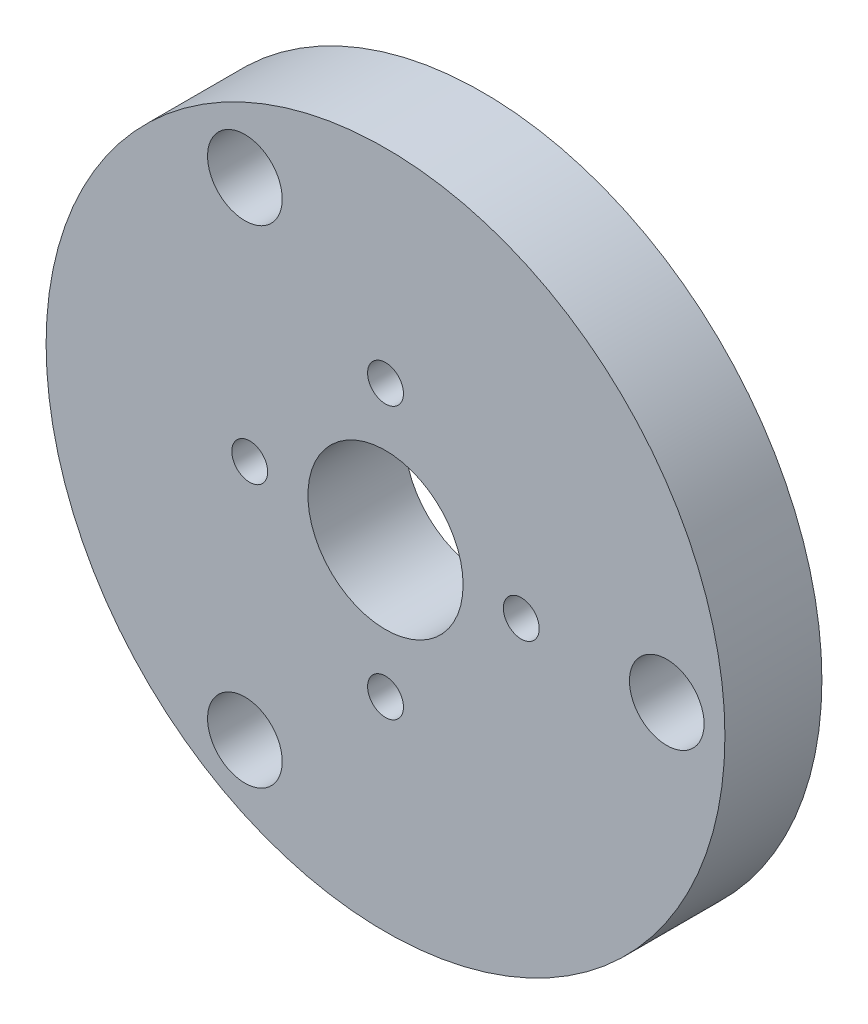
ISO-10303-21;
HEADER;
FILE_DESCRIPTION(('STEP AP214'),'2;1');
FILE_NAME('part.step','',(''),(''),'','','');
FILE_SCHEMA(('AUTOMOTIVE_DESIGN { 1 0 10303 214 1 1 1 1 }'));
ENDSEC;
DATA;
#1=APPLICATION_CONTEXT('core data for automotive mechanical design processes');
#2=APPLICATION_PROTOCOL_DEFINITION('international standard','automotive_design',2000,#1);
#3=PRODUCT_CONTEXT('',#1,'mechanical');
#4=PRODUCT('Part','Part','',(#3));
#5=PRODUCT_RELATED_PRODUCT_CATEGORY('part','',(#4));
#6=PRODUCT_DEFINITION_FORMATION('','',#4);
#7=PRODUCT_DEFINITION_CONTEXT('part definition',#1,'design');
#8=PRODUCT_DEFINITION('design','',#6,#7);
#9=PRODUCT_DEFINITION_SHAPE('','',#8);
#10=(LENGTH_UNIT() NAMED_UNIT(*) SI_UNIT(.MILLI.,.METRE.));
#11=(NAMED_UNIT(*) PLANE_ANGLE_UNIT() SI_UNIT($,.RADIAN.));
#12=(NAMED_UNIT(*) SI_UNIT($,.STERADIAN.) SOLID_ANGLE_UNIT());
#13=UNCERTAINTY_MEASURE_WITH_UNIT(LENGTH_MEASURE(1.E-05),#10,'distance_accuracy_value','');
#14=(GEOMETRIC_REPRESENTATION_CONTEXT(3) GLOBAL_UNCERTAINTY_ASSIGNED_CONTEXT((#13)) GLOBAL_UNIT_ASSIGNED_CONTEXT((#10,
#11,#12)) REPRESENTATION_CONTEXT('',''));
#15=CARTESIAN_POINT('',(0.,0.,0.));
#16=DIRECTION('',(0.,0.,1.));
#17=DIRECTION('',(1.,0.,0.));
#18=AXIS2_PLACEMENT_3D('',#15,#16,#17);
#19=CARTESIAN_POINT('',(0.,-2.22044604925031E-13,5.));
#20=DIRECTION('',(0.,0.,1.));
#21=DIRECTION('',(1.,0.,0.));
#22=AXIS2_PLACEMENT_3D('',#19,#20,#21);
#23=PLANE('',#22);
#24=CARTESIAN_POINT('',(14.5000000000001,-2.22044604925031E-13,5.));
#25=DIRECTION('',(0.,0.,1.));
#26=DIRECTION('',(1.,0.,0.));
#27=AXIS2_PLACEMENT_3D('',#24,#25,#26);
#28=CIRCLE('',#27,1.92499999999995);
#29=CARTESIAN_POINT('',(16.425,-2.22044604925031E-13,5.));
#30=VERTEX_POINT('',#29);
#31=EDGE_CURVE('E76',#30,#30,#28,.T.);
#32=ORIENTED_EDGE('',*,*,#31,.F.);
#33=EDGE_LOOP('',(#32));
#34=FACE_BOUND('',#33,.T.);
#35=CARTESIAN_POINT('',(-7.24999999999972,12.5573683548746,5.));
#36=DIRECTION('',(0.,0.,1.));
#37=DIRECTION('',(1.,0.,0.));
#38=AXIS2_PLACEMENT_3D('',#35,#36,#37);
#39=CIRCLE('',#38,1.92499999999995);
#40=CARTESIAN_POINT('',(-5.32499999999977,12.5573683548746,5.));
#41=VERTEX_POINT('',#40);
#42=EDGE_CURVE('E64',#41,#41,#39,.T.);
#43=ORIENTED_EDGE('',*,*,#42,.F.);
#44=EDGE_LOOP('',(#43));
#45=FACE_BOUND('',#44,.T.);
#46=CARTESIAN_POINT('',(0.,7.00000000000006,5.));
#47=DIRECTION('',(0.,0.,1.));
#48=DIRECTION('',(1.,0.,0.));
#49=AXIS2_PLACEMENT_3D('',#46,#47,#48);
#50=CIRCLE('',#49,0.925000000000009);
#51=CARTESIAN_POINT('',(0.925000000000007,7.00000000000006,5.));
#52=VERTEX_POINT('',#51);
#53=EDGE_CURVE('E52',#52,#52,#50,.T.);
#54=ORIENTED_EDGE('',*,*,#53,.F.);
#55=EDGE_LOOP('',(#54));
#56=FACE_BOUND('',#55,.T.);
#57=CARTESIAN_POINT('',(0.,-7.00000000000006,5.));
#58=DIRECTION('',(0.,0.,1.));
#59=DIRECTION('',(1.,0.,0.));
#60=AXIS2_PLACEMENT_3D('',#57,#58,#59);
#61=CIRCLE('',#60,0.925000000000009);
#62=CARTESIAN_POINT('',(0.92500000000001,-7.00000000000006,5.));
#63=VERTEX_POINT('',#62);
#64=EDGE_CURVE('E41',#63,#63,#61,.T.);
#65=ORIENTED_EDGE('',*,*,#64,.F.);
#66=EDGE_LOOP('',(#65));
#67=FACE_BOUND('',#66,.T.);
#68=CARTESIAN_POINT('',(0.,-2.22044604925031E-13,5.));
#69=DIRECTION('',(0.,0.,1.));
#70=DIRECTION('',(1.,0.,0.));
#71=AXIS2_PLACEMENT_3D('',#68,#69,#70);
#72=CIRCLE('',#71,17.5);
#73=CARTESIAN_POINT('',(17.5000000000001,-2.22044604925031E-13,5.));
#74=VERTEX_POINT('',#73);
#75=EDGE_CURVE('E10',#74,#74,#72,.T.);
#76=ORIENTED_EDGE('',*,*,#75,.T.);
#77=EDGE_LOOP('',(#76));
#78=FACE_BOUND('',#77,.T.);
#79=CARTESIAN_POINT('',(-7.00000000000006,0.,5.));
#80=DIRECTION('',(0.,0.,1.));
#81=DIRECTION('',(1.,0.,0.));
#82=AXIS2_PLACEMENT_3D('',#79,#80,#81);
#83=CIRCLE('',#82,0.925000000000009);
#84=CARTESIAN_POINT('',(-6.07500000000005,0.,5.));
#85=VERTEX_POINT('',#84);
#86=EDGE_CURVE('E46',#85,#85,#83,.T.);
#87=ORIENTED_EDGE('',*,*,#86,.F.);
#88=EDGE_LOOP('',(#87));
#89=FACE_BOUND('',#88,.T.);
#90=CARTESIAN_POINT('',(-7.25000000000029,-12.5573683548743,5.));
#91=DIRECTION('',(0.,0.,1.));
#92=DIRECTION('',(1.,0.,0.));
#93=AXIS2_PLACEMENT_3D('',#90,#91,#92);
#94=CIRCLE('',#93,1.92499999999996);
#95=CARTESIAN_POINT('',(-5.32500000000033,-12.5573683548743,5.));
#96=VERTEX_POINT('',#95);
#97=EDGE_CURVE('E58',#96,#96,#94,.T.);
#98=ORIENTED_EDGE('',*,*,#97,.F.);
#99=EDGE_LOOP('',(#98));
#100=FACE_BOUND('',#99,.T.);
#101=CARTESIAN_POINT('',(0.,-2.22044604925031E-13,5.));
#102=DIRECTION('',(0.,0.,1.));
#103=DIRECTION('',(1.,0.,0.));
#104=AXIS2_PLACEMENT_3D('',#101,#102,#103);
#105=CIRCLE('',#104,4.);
#106=CARTESIAN_POINT('',(4.00000000000006,-2.22044604925031E-13,5.));
#107=VERTEX_POINT('',#106);
#108=EDGE_CURVE('E70',#107,#107,#105,.T.);
#109=ORIENTED_EDGE('',*,*,#108,.F.);
#110=EDGE_LOOP('',(#109));
#111=FACE_BOUND('',#110,.T.);
#112=CARTESIAN_POINT('',(7.00000000000006,0.,5.));
#113=DIRECTION('',(0.,0.,1.));
#114=DIRECTION('',(1.,0.,0.));
#115=AXIS2_PLACEMENT_3D('',#112,#113,#114);
#116=CIRCLE('',#115,0.925000000000009);
#117=CARTESIAN_POINT('',(7.92500000000006,0.,5.));
#118=VERTEX_POINT('',#117);
#119=EDGE_CURVE('E82',#118,#118,#116,.T.);
#120=ORIENTED_EDGE('',*,*,#119,.F.);
#121=EDGE_LOOP('',(#120));
#122=FACE_BOUND('',#121,.T.);
#123=ADVANCED_FACE('F30',(#34,#45,#56,#67,#78,#89,#100,#111,#122),#23,.T.);
#124=CARTESIAN_POINT('',(0.,-2.22044604925031E-13,0.));
#125=DIRECTION('',(0.,0.,1.));
#126=DIRECTION('',(1.,0.,0.));
#127=AXIS2_PLACEMENT_3D('',#124,#125,#126);
#128=PLANE('',#127);
#129=CARTESIAN_POINT('',(0.,-2.22044604925031E-13,0.));
#130=DIRECTION('',(0.,0.,1.));
#131=DIRECTION('',(1.,0.,0.));
#132=AXIS2_PLACEMENT_3D('',#129,#130,#131);
#133=CIRCLE('',#132,17.5);
#134=CARTESIAN_POINT('',(17.5000000000001,-2.22044604925031E-13,0.));
#135=VERTEX_POINT('',#134);
#136=EDGE_CURVE('E34',#135,#135,#133,.T.);
#137=ORIENTED_EDGE('',*,*,#136,.F.);
#138=EDGE_LOOP('',(#137));
#139=FACE_BOUND('',#138,.T.);
#140=CARTESIAN_POINT('',(0.,-7.00000000000006,0.));
#141=DIRECTION('',(0.,0.,1.));
#142=DIRECTION('',(1.,0.,0.));
#143=AXIS2_PLACEMENT_3D('',#140,#141,#142);
#144=CIRCLE('',#143,0.925000000000009);
#145=CARTESIAN_POINT('',(0.92500000000001,-7.00000000000006,0.));
#146=VERTEX_POINT('',#145);
#147=EDGE_CURVE('E43',#146,#146,#144,.T.);
#148=ORIENTED_EDGE('',*,*,#147,.T.);
#149=EDGE_LOOP('',(#148));
#150=FACE_BOUND('',#149,.T.);
#151=CARTESIAN_POINT('',(-7.00000000000006,0.,0.));
#152=DIRECTION('',(0.,0.,1.));
#153=DIRECTION('',(1.,0.,0.));
#154=AXIS2_PLACEMENT_3D('',#151,#152,#153);
#155=CIRCLE('',#154,0.925000000000009);
#156=CARTESIAN_POINT('',(-6.07500000000005,0.,0.));
#157=VERTEX_POINT('',#156);
#158=EDGE_CURVE('E49',#157,#157,#155,.T.);
#159=ORIENTED_EDGE('',*,*,#158,.T.);
#160=EDGE_LOOP('',(#159));
#161=FACE_BOUND('',#160,.T.);
#162=CARTESIAN_POINT('',(0.,7.00000000000006,0.));
#163=DIRECTION('',(0.,0.,1.));
#164=DIRECTION('',(1.,0.,0.));
#165=AXIS2_PLACEMENT_3D('',#162,#163,#164);
#166=CIRCLE('',#165,0.925000000000009);
#167=CARTESIAN_POINT('',(0.925000000000007,7.00000000000006,0.));
#168=VERTEX_POINT('',#167);
#169=EDGE_CURVE('E55',#168,#168,#166,.T.);
#170=ORIENTED_EDGE('',*,*,#169,.T.);
#171=EDGE_LOOP('',(#170));
#172=FACE_BOUND('',#171,.T.);
#173=CARTESIAN_POINT('',(-7.25000000000029,-12.5573683548743,0.));
#174=DIRECTION('',(0.,0.,1.));
#175=DIRECTION('',(1.,0.,0.));
#176=AXIS2_PLACEMENT_3D('',#173,#174,#175);
#177=CIRCLE('',#176,1.92499999999996);
#178=CARTESIAN_POINT('',(-5.32500000000033,-12.5573683548743,0.));
#179=VERTEX_POINT('',#178);
#180=EDGE_CURVE('E61',#179,#179,#177,.T.);
#181=ORIENTED_EDGE('',*,*,#180,.T.);
#182=EDGE_LOOP('',(#181));
#183=FACE_BOUND('',#182,.T.);
#184=CARTESIAN_POINT('',(-7.24999999999972,12.5573683548746,0.));
#185=DIRECTION('',(0.,0.,1.));
#186=DIRECTION('',(1.,0.,0.));
#187=AXIS2_PLACEMENT_3D('',#184,#185,#186);
#188=CIRCLE('',#187,1.92499999999995);
#189=CARTESIAN_POINT('',(-5.32499999999977,12.5573683548746,0.));
#190=VERTEX_POINT('',#189);
#191=EDGE_CURVE('E67',#190,#190,#188,.T.);
#192=ORIENTED_EDGE('',*,*,#191,.T.);
#193=EDGE_LOOP('',(#192));
#194=FACE_BOUND('',#193,.T.);
#195=CARTESIAN_POINT('',(0.,-2.22044604925031E-13,0.));
#196=DIRECTION('',(0.,0.,1.));
#197=DIRECTION('',(1.,0.,0.));
#198=AXIS2_PLACEMENT_3D('',#195,#196,#197);
#199=CIRCLE('',#198,4.);
#200=CARTESIAN_POINT('',(4.00000000000006,-2.22044604925031E-13,0.));
#201=VERTEX_POINT('',#200);
#202=EDGE_CURVE('E73',#201,#201,#199,.T.);
#203=ORIENTED_EDGE('',*,*,#202,.T.);
#204=EDGE_LOOP('',(#203));
#205=FACE_BOUND('',#204,.T.);
#206=CARTESIAN_POINT('',(14.5000000000001,-2.22044604925031E-13,0.));
#207=DIRECTION('',(0.,0.,1.));
#208=DIRECTION('',(1.,0.,0.));
#209=AXIS2_PLACEMENT_3D('',#206,#207,#208);
#210=CIRCLE('',#209,1.92499999999995);
#211=CARTESIAN_POINT('',(16.425,-2.22044604925031E-13,0.));
#212=VERTEX_POINT('',#211);
#213=EDGE_CURVE('E79',#212,#212,#210,.T.);
#214=ORIENTED_EDGE('',*,*,#213,.T.);
#215=EDGE_LOOP('',(#214));
#216=FACE_BOUND('',#215,.T.);
#217=CARTESIAN_POINT('',(7.00000000000006,0.,0.));
#218=DIRECTION('',(0.,0.,1.));
#219=DIRECTION('',(1.,0.,0.));
#220=AXIS2_PLACEMENT_3D('',#217,#218,#219);
#221=CIRCLE('',#220,0.925000000000009);
#222=CARTESIAN_POINT('',(7.92500000000006,0.,0.));
#223=VERTEX_POINT('',#222);
#224=EDGE_CURVE('E85',#223,#223,#221,.T.);
#225=ORIENTED_EDGE('',*,*,#224,.T.);
#226=EDGE_LOOP('',(#225));
#227=FACE_BOUND('',#226,.T.);
#228=ADVANCED_FACE('F95',(#139,#150,#161,#172,#183,#194,#205,#216,#227),#128,.F.);
#229=CARTESIAN_POINT('',(0.,-2.22044604925031E-13,5.));
#230=DIRECTION('',(0.,0.,-1.));
#231=DIRECTION('',(-1.,0.,0.));
#232=AXIS2_PLACEMENT_3D('',#229,#230,#231);
#233=CYLINDRICAL_SURFACE('',#232,17.5);
#234=ORIENTED_EDGE('',*,*,#75,.F.);
#235=EDGE_LOOP('',(#234));
#236=FACE_BOUND('',#235,.T.);
#237=ORIENTED_EDGE('',*,*,#136,.T.);
#238=EDGE_LOOP('',(#237));
#239=FACE_BOUND('',#238,.T.);
#240=ADVANCED_FACE('F32',(#236,#239),#233,.T.);
#241=CARTESIAN_POINT('',(0.,-7.00000000000006,5.));
#242=DIRECTION('',(0.,0.,-1.));
#243=DIRECTION('',(-1.,0.,0.));
#244=AXIS2_PLACEMENT_3D('',#241,#242,#243);
#245=CYLINDRICAL_SURFACE('',#244,0.925000000000009);
#246=ORIENTED_EDGE('',*,*,#64,.T.);
#247=EDGE_LOOP('',(#246));
#248=FACE_BOUND('',#247,.T.);
#249=ORIENTED_EDGE('',*,*,#147,.F.);
#250=EDGE_LOOP('',(#249));
#251=FACE_BOUND('',#250,.T.);
#252=ADVANCED_FACE('F105',(#248,#251),#245,.F.);
#253=CARTESIAN_POINT('',(-7.00000000000006,0.,5.));
#254=DIRECTION('',(0.,0.,-1.));
#255=DIRECTION('',(-1.,0.,0.));
#256=AXIS2_PLACEMENT_3D('',#253,#254,#255);
#257=CYLINDRICAL_SURFACE('',#256,0.925000000000009);
#258=ORIENTED_EDGE('',*,*,#86,.T.);
#259=EDGE_LOOP('',(#258));
#260=FACE_BOUND('',#259,.T.);
#261=ORIENTED_EDGE('',*,*,#158,.F.);
#262=EDGE_LOOP('',(#261));
#263=FACE_BOUND('',#262,.T.);
#264=ADVANCED_FACE('F108',(#260,#263),#257,.F.);
#265=CARTESIAN_POINT('',(0.,7.00000000000006,5.));
#266=DIRECTION('',(0.,0.,-1.));
#267=DIRECTION('',(-1.,0.,0.));
#268=AXIS2_PLACEMENT_3D('',#265,#266,#267);
#269=CYLINDRICAL_SURFACE('',#268,0.925000000000009);
#270=ORIENTED_EDGE('',*,*,#53,.T.);
#271=EDGE_LOOP('',(#270));
#272=FACE_BOUND('',#271,.T.);
#273=ORIENTED_EDGE('',*,*,#169,.F.);
#274=EDGE_LOOP('',(#273));
#275=FACE_BOUND('',#274,.T.);
#276=ADVANCED_FACE('F112',(#272,#275),#269,.F.);
#277=CARTESIAN_POINT('',(-7.25000000000029,-12.5573683548743,5.));
#278=DIRECTION('',(0.,0.,-1.));
#279=DIRECTION('',(-1.,0.,0.));
#280=AXIS2_PLACEMENT_3D('',#277,#278,#279);
#281=CYLINDRICAL_SURFACE('',#280,1.92499999999996);
#282=ORIENTED_EDGE('',*,*,#97,.T.);
#283=EDGE_LOOP('',(#282));
#284=FACE_BOUND('',#283,.T.);
#285=ORIENTED_EDGE('',*,*,#180,.F.);
#286=EDGE_LOOP('',(#285));
#287=FACE_BOUND('',#286,.T.);
#288=ADVANCED_FACE('F116',(#284,#287),#281,.F.);
#289=CARTESIAN_POINT('',(-7.24999999999972,12.5573683548746,5.));
#290=DIRECTION('',(0.,0.,-1.));
#291=DIRECTION('',(-1.,0.,0.));
#292=AXIS2_PLACEMENT_3D('',#289,#290,#291);
#293=CYLINDRICAL_SURFACE('',#292,1.92499999999995);
#294=ORIENTED_EDGE('',*,*,#42,.T.);
#295=EDGE_LOOP('',(#294));
#296=FACE_BOUND('',#295,.T.);
#297=ORIENTED_EDGE('',*,*,#191,.F.);
#298=EDGE_LOOP('',(#297));
#299=FACE_BOUND('',#298,.T.);
#300=ADVANCED_FACE('F120',(#296,#299),#293,.F.);
#301=CARTESIAN_POINT('',(0.,-2.22044604925031E-13,5.));
#302=DIRECTION('',(0.,0.,-1.));
#303=DIRECTION('',(-1.,0.,0.));
#304=AXIS2_PLACEMENT_3D('',#301,#302,#303);
#305=CYLINDRICAL_SURFACE('',#304,4.);
#306=ORIENTED_EDGE('',*,*,#108,.T.);
#307=EDGE_LOOP('',(#306));
#308=FACE_BOUND('',#307,.T.);
#309=ORIENTED_EDGE('',*,*,#202,.F.);
#310=EDGE_LOOP('',(#309));
#311=FACE_BOUND('',#310,.T.);
#312=ADVANCED_FACE('F124',(#308,#311),#305,.F.);
#313=CARTESIAN_POINT('',(14.5000000000001,-2.22044604925031E-13,5.));
#314=DIRECTION('',(0.,0.,-1.));
#315=DIRECTION('',(-1.,0.,0.));
#316=AXIS2_PLACEMENT_3D('',#313,#314,#315);
#317=CYLINDRICAL_SURFACE('',#316,1.92499999999995);
#318=ORIENTED_EDGE('',*,*,#31,.T.);
#319=EDGE_LOOP('',(#318));
#320=FACE_BOUND('',#319,.T.);
#321=ORIENTED_EDGE('',*,*,#213,.F.);
#322=EDGE_LOOP('',(#321));
#323=FACE_BOUND('',#322,.T.);
#324=ADVANCED_FACE('F128',(#320,#323),#317,.F.);
#325=CARTESIAN_POINT('',(7.00000000000006,0.,5.));
#326=DIRECTION('',(0.,0.,-1.));
#327=DIRECTION('',(-1.,0.,0.));
#328=AXIS2_PLACEMENT_3D('',#325,#326,#327);
#329=CYLINDRICAL_SURFACE('',#328,0.925000000000009);
#330=ORIENTED_EDGE('',*,*,#119,.T.);
#331=EDGE_LOOP('',(#330));
#332=FACE_BOUND('',#331,.T.);
#333=ORIENTED_EDGE('',*,*,#224,.F.);
#334=EDGE_LOOP('',(#333));
#335=FACE_BOUND('',#334,.T.);
#336=ADVANCED_FACE('F91',(#332,#335),#329,.F.);
#337=CLOSED_SHELL('',(#123,#228,#240,#252,#264,#276,#288,#300,#312,#324,#336));
#338=MANIFOLD_SOLID_BREP('B2',#337);
#339=ADVANCED_BREP_SHAPE_REPRESENTATION('',(#18,#338),#14);
#340=SHAPE_DEFINITION_REPRESENTATION(#9,#339);
ENDSEC;
END-ISO-10303-21;
